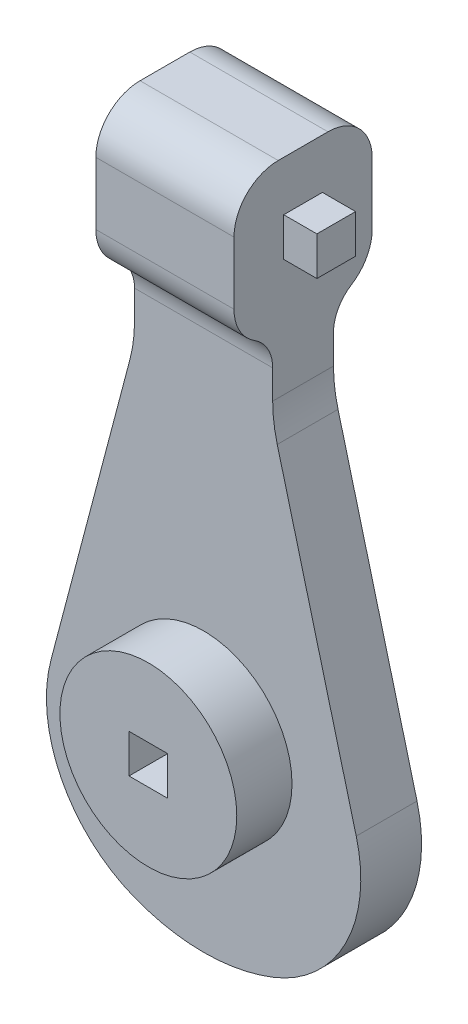
ISO-10303-21;
HEADER;
FILE_DESCRIPTION(('STEP AP214'),'2;1');
FILE_NAME('part.step','',(''),(''),'','','');
FILE_SCHEMA(('AUTOMOTIVE_DESIGN { 1 0 10303 214 1 1 1 1 }'));
ENDSEC;
DATA;
#1=APPLICATION_CONTEXT('core data for automotive mechanical design processes');
#2=APPLICATION_PROTOCOL_DEFINITION('international standard','automotive_design',2000,#1);
#3=PRODUCT_CONTEXT('',#1,'mechanical');
#4=PRODUCT('Part','Part','',(#3));
#5=PRODUCT_RELATED_PRODUCT_CATEGORY('part','',(#4));
#6=PRODUCT_DEFINITION_FORMATION('','',#4);
#7=PRODUCT_DEFINITION_CONTEXT('part definition',#1,'design');
#8=PRODUCT_DEFINITION('design','',#6,#7);
#9=PRODUCT_DEFINITION_SHAPE('','',#8);
#10=(LENGTH_UNIT() NAMED_UNIT(*) SI_UNIT(.MILLI.,.METRE.));
#11=(NAMED_UNIT(*) PLANE_ANGLE_UNIT() SI_UNIT($,.RADIAN.));
#12=(NAMED_UNIT(*) SI_UNIT($,.STERADIAN.) SOLID_ANGLE_UNIT());
#13=UNCERTAINTY_MEASURE_WITH_UNIT(LENGTH_MEASURE(1.E-05),#10,'distance_accuracy_value','');
#14=(GEOMETRIC_REPRESENTATION_CONTEXT(3) GLOBAL_UNCERTAINTY_ASSIGNED_CONTEXT((#13)) GLOBAL_UNIT_ASSIGNED_CONTEXT((#10,
#11,#12)) REPRESENTATION_CONTEXT('',''));
#15=CARTESIAN_POINT('',(0.,0.,0.));
#16=DIRECTION('',(0.,0.,1.));
#17=DIRECTION('',(1.,0.,0.));
#18=AXIS2_PLACEMENT_3D('',#15,#16,#17);
#19=CARTESIAN_POINT('',(-12.5,63.4518338469886,-18.));
#20=DIRECTION('',(-1.,0.,0.));
#21=DIRECTION('',(0.,0.,1.));
#22=AXIS2_PLACEMENT_3D('',#19,#20,#21);
#23=CYLINDRICAL_SURFACE('',#22,7.);
#24=CARTESIAN_POINT('',(-12.5,63.4518338469886,-18.));
#25=DIRECTION('',(1.,0.,0.));
#26=DIRECTION('',(0.,0.,-1.));
#27=AXIS2_PLACEMENT_3D('',#24,#25,#26);
#28=CIRCLE('',#27,7.);
#29=CARTESIAN_POINT('',(-12.5,63.4518338469886,-11.));
#30=VERTEX_POINT('',#29);
#31=CARTESIAN_POINT('',(-12.5,69.3731700325317,-14.2666666666667));
#32=VERTEX_POINT('',#31);
#33=EDGE_CURVE('E449',#30,#32,#28,.F.);
#34=ORIENTED_EDGE('',*,*,#33,.T.);
#35=DIRECTION('',(-1.,0.,0.));
#36=VECTOR('',#35,1.);
#37=CARTESIAN_POINT('',(-12.5,69.3731700325317,-14.2666666666667));
#38=LINE('',#37,#36);
#39=CARTESIAN_POINT('',(12.5,69.3731700325317,-14.2666666666667));
#40=VERTEX_POINT('',#39);
#41=EDGE_CURVE('E474',#32,#40,#38,.F.);
#42=ORIENTED_EDGE('',*,*,#41,.T.);
#43=CARTESIAN_POINT('',(12.5,63.4518338469886,-18.));
#44=DIRECTION('',(1.,0.,0.));
#45=DIRECTION('',(0.,0.,-1.));
#46=AXIS2_PLACEMENT_3D('',#43,#44,#45);
#47=CIRCLE('',#46,7.);
#48=CARTESIAN_POINT('',(12.5,63.4518338469886,-11.));
#49=VERTEX_POINT('',#48);
#50=EDGE_CURVE('E447',#40,#49,#47,.T.);
#51=ORIENTED_EDGE('',*,*,#50,.T.);
#52=DIRECTION('',(-1.,0.,0.));
#53=VECTOR('',#52,1.);
#54=CARTESIAN_POINT('',(0.,63.4518338469886,-11.));
#55=LINE('',#54,#53);
#56=EDGE_CURVE('E444',#30,#49,#55,.F.);
#57=ORIENTED_EDGE('',*,*,#56,.F.);
#58=EDGE_LOOP('',(#34,#42,#51,#57));
#59=FACE_BOUND('',#58,.T.);
#60=ADVANCED_FACE('F38',(#59),#23,.F.);
#61=CARTESIAN_POINT('',(-12.5,63.4518338469886,7.));
#62=DIRECTION('',(-1.,0.,0.));
#63=DIRECTION('',(0.,0.,1.));
#64=AXIS2_PLACEMENT_3D('',#61,#62,#63);
#65=CYLINDRICAL_SURFACE('',#64,7.);
#66=CARTESIAN_POINT('',(12.5,63.4518338469886,7.));
#67=DIRECTION('',(1.,0.,0.));
#68=DIRECTION('',(0.,0.,-1.));
#69=AXIS2_PLACEMENT_3D('',#66,#67,#68);
#70=CIRCLE('',#69,7.);
#71=CARTESIAN_POINT('',(12.5,63.4518338469886,0.));
#72=VERTEX_POINT('',#71);
#73=CARTESIAN_POINT('',(12.5,69.3731700325317,3.26666666666666));
#74=VERTEX_POINT('',#73);
#75=EDGE_CURVE('E441',#72,#74,#70,.T.);
#76=ORIENTED_EDGE('',*,*,#75,.T.);
#77=DIRECTION('',(-1.,0.,0.));
#78=VECTOR('',#77,1.);
#79=CARTESIAN_POINT('',(-12.5,69.3731700325317,3.26666666666667));
#80=LINE('',#79,#78);
#81=CARTESIAN_POINT('',(-12.5,69.3731700325317,3.26666666666666));
#82=VERTEX_POINT('',#81);
#83=EDGE_CURVE('E465',#74,#82,#80,.T.);
#84=ORIENTED_EDGE('',*,*,#83,.T.);
#85=CARTESIAN_POINT('',(-12.5,63.4518338469886,7.));
#86=DIRECTION('',(1.,0.,0.));
#87=DIRECTION('',(0.,0.,-1.));
#88=AXIS2_PLACEMENT_3D('',#85,#86,#87);
#89=CIRCLE('',#88,7.);
#90=CARTESIAN_POINT('',(-12.5,63.4518338469886,0.));
#91=VERTEX_POINT('',#90);
#92=EDGE_CURVE('E439',#82,#91,#89,.F.);
#93=ORIENTED_EDGE('',*,*,#92,.T.);
#94=DIRECTION('',(1.,0.,0.));
#95=VECTOR('',#94,1.);
#96=CARTESIAN_POINT('',(-12.5,63.4518338469886,0.));
#97=LINE('',#96,#95);
#98=EDGE_CURVE('E436',#72,#91,#97,.F.);
#99=ORIENTED_EDGE('',*,*,#98,.F.);
#100=EDGE_LOOP('',(#76,#84,#93,#99));
#101=FACE_BOUND('',#100,.T.);
#102=ADVANCED_FACE('F507',(#101),#65,.F.);
#103=CARTESIAN_POINT('',(12.5,0.,-11.));
#104=DIRECTION('',(1.,0.,0.));
#105=DIRECTION('',(0.,0.,-1.));
#106=AXIS2_PLACEMENT_3D('',#103,#104,#105);
#107=PLANE('',#106);
#108=DIRECTION('',(0.,1.,0.));
#109=VECTOR('',#108,1.);
#110=CARTESIAN_POINT('',(12.5,70.4518338469886,7.));
#111=LINE('',#110,#109);
#112=CARTESIAN_POINT('',(12.5,76.1404113874381,7.));
#113=VERTEX_POINT('',#112);
#114=CARTESIAN_POINT('',(12.5,87.4518338469886,7.));
#115=VERTEX_POINT('',#114);
#116=EDGE_CURVE('E309',#113,#115,#111,.T.);
#117=ORIENTED_EDGE('',*,*,#116,.F.);
#118=CARTESIAN_POINT('',(12.5,76.1404113874381,-1.));
#119=DIRECTION('',(1.,0.,0.));
#120=DIRECTION('',(0.,0.,-1.));
#121=AXIS2_PLACEMENT_3D('',#118,#119,#120);
#122=CIRCLE('',#121,8.);
#123=EDGE_CURVE('E463',#113,#74,#122,.T.);
#124=ORIENTED_EDGE('',*,*,#123,.T.);
#125=ORIENTED_EDGE('',*,*,#75,.F.);
#126=DIRECTION('',(0.,1.,0.));
#127=VECTOR('',#126,1.);
#128=CARTESIAN_POINT('',(12.5,0.,0.));
#129=LINE('',#128,#127);
#130=CARTESIAN_POINT('',(12.5,58.2388212767748,0.));
#131=VERTEX_POINT('',#130);
#132=EDGE_CURVE('E395',#131,#72,#129,.T.);
#133=ORIENTED_EDGE('',*,*,#132,.F.);
#134=DIRECTION('',(0.,0.,1.));
#135=VECTOR('',#134,1.);
#136=CARTESIAN_POINT('',(12.5,58.2388212767748,-11.));
#137=LINE('',#136,#135);
#138=CARTESIAN_POINT('',(12.5,58.2388212767748,-11.));
#139=VERTEX_POINT('',#138);
#140=EDGE_CURVE('E392',#139,#131,#137,.T.);
#141=ORIENTED_EDGE('',*,*,#140,.F.);
#142=DIRECTION('',(0.,1.,0.));
#143=VECTOR('',#142,1.);
#144=CARTESIAN_POINT('',(12.5,0.,-11.));
#145=LINE('',#144,#143);
#146=EDGE_CURVE('E371',#139,#49,#145,.T.);
#147=ORIENTED_EDGE('',*,*,#146,.T.);
#148=ORIENTED_EDGE('',*,*,#50,.F.);
#149=CARTESIAN_POINT('',(12.5,76.1404113874381,-10.));
#150=DIRECTION('',(1.,0.,0.));
#151=DIRECTION('',(0.,0.,-1.));
#152=AXIS2_PLACEMENT_3D('',#149,#150,#151);
#153=CIRCLE('',#152,8.);
#154=CARTESIAN_POINT('',(12.5,76.1404113874381,-18.));
#155=VERTEX_POINT('',#154);
#156=EDGE_CURVE('E461',#40,#155,#153,.T.);
#157=ORIENTED_EDGE('',*,*,#156,.T.);
#158=DIRECTION('',(0.,1.,0.));
#159=VECTOR('',#158,1.);
#160=CARTESIAN_POINT('',(12.5,70.4518338469886,-18.));
#161=LINE('',#160,#159);
#162=CARTESIAN_POINT('',(12.5,87.4518338469886,-18.));
#163=VERTEX_POINT('',#162);
#164=EDGE_CURVE('E315',#155,#163,#161,.T.);
#165=ORIENTED_EDGE('',*,*,#164,.T.);
#166=CARTESIAN_POINT('',(12.5,87.4518338469886,-10.));
#167=DIRECTION('',(1.,0.,0.));
#168=DIRECTION('',(0.,0.,-1.));
#169=AXIS2_PLACEMENT_3D('',#166,#167,#168);
#170=CIRCLE('',#169,8.);
#171=CARTESIAN_POINT('',(12.5,95.4518338469886,-10.));
#172=VERTEX_POINT('',#171);
#173=EDGE_CURVE('E459',#163,#172,#170,.T.);
#174=ORIENTED_EDGE('',*,*,#173,.T.);
#175=DIRECTION('',(0.,0.,1.));
#176=VECTOR('',#175,1.);
#177=CARTESIAN_POINT('',(12.5,95.4518338469886,-18.));
#178=LINE('',#177,#176);
#179=CARTESIAN_POINT('',(12.5,95.4518338469886,-1.));
#180=VERTEX_POINT('',#179);
#181=EDGE_CURVE('E320',#172,#180,#178,.T.);
#182=ORIENTED_EDGE('',*,*,#181,.T.);
#183=CARTESIAN_POINT('',(12.5,87.4518338469886,-1.));
#184=DIRECTION('',(1.,0.,0.));
#185=DIRECTION('',(0.,0.,-1.));
#186=AXIS2_PLACEMENT_3D('',#183,#184,#185);
#187=CIRCLE('',#186,8.);
#188=EDGE_CURVE('E457',#180,#115,#187,.T.);
#189=ORIENTED_EDGE('',*,*,#188,.T.);
#190=EDGE_LOOP('',(#117,#124,#125,#133,#141,#147,#148,#157,#165,#174,#182,#189));
#191=FACE_BOUND('',#190,.T.);
#192=DIRECTION('',(0.,0.,1.));
#193=VECTOR('',#192,1.);
#194=CARTESIAN_POINT('',(12.5,86.4518338469886,-2.));
#195=LINE('',#194,#193);
#196=CARTESIAN_POINT('',(12.5,86.4518338469886,-9.));
#197=VERTEX_POINT('',#196);
#198=CARTESIAN_POINT('',(12.5,86.4518338469886,-2.));
#199=VERTEX_POINT('',#198);
#200=EDGE_CURVE('E294',#197,#199,#195,.T.);
#201=ORIENTED_EDGE('',*,*,#200,.F.);
#202=DIRECTION('',(0.,1.,0.));
#203=VECTOR('',#202,1.);
#204=CARTESIAN_POINT('',(12.5,79.4518338469886,-9.));
#205=LINE('',#204,#203);
#206=CARTESIAN_POINT('',(12.5,79.4518338469886,-9.));
#207=VERTEX_POINT('',#206);
#208=EDGE_CURVE('E248',#207,#197,#205,.T.);
#209=ORIENTED_EDGE('',*,*,#208,.F.);
#210=DIRECTION('',(0.,0.,-1.));
#211=VECTOR('',#210,1.);
#212=CARTESIAN_POINT('',(12.5,79.4518338469886,-2.));
#213=LINE('',#212,#211);
#214=CARTESIAN_POINT('',(12.5,79.4518338469886,-2.));
#215=VERTEX_POINT('',#214);
#216=EDGE_CURVE('E285',#215,#207,#213,.T.);
#217=ORIENTED_EDGE('',*,*,#216,.F.);
#218=DIRECTION('',(0.,-1.,0.));
#219=VECTOR('',#218,1.);
#220=CARTESIAN_POINT('',(12.5,79.4518338469886,-2.));
#221=LINE('',#220,#219);
#222=EDGE_CURVE('E296',#199,#215,#221,.T.);
#223=ORIENTED_EDGE('',*,*,#222,.F.);
#224=EDGE_LOOP('',(#201,#209,#217,#223));
#225=FACE_BOUND('',#224,.T.);
#226=ADVANCED_FACE('F489',(#191,#225),#107,.T.);
#227=CARTESIAN_POINT('',(0.,0.,-11.));
#228=DIRECTION('',(0.,0.,1.));
#229=DIRECTION('',(1.,0.,0.));
#230=AXIS2_PLACEMENT_3D('',#227,#228,#229);
#231=PLANE('',#230);
#232=CARTESIAN_POINT('',(0.,0.,-11.));
#233=DIRECTION('',(0.,0.,1.));
#234=DIRECTION('',(1.,0.,0.));
#235=AXIS2_PLACEMENT_3D('',#232,#233,#234);
#236=CIRCLE('',#235,20.);
#237=CARTESIAN_POINT('',(20.,0.,-11.));
#238=VERTEX_POINT('',#237);
#239=EDGE_CURVE('E365',#238,#238,#236,.T.);
#240=ORIENTED_EDGE('',*,*,#239,.T.);
#241=EDGE_LOOP('',(#240));
#242=FACE_BOUND('',#241,.T.);
#243=DIRECTION('',(0.,1.,0.));
#244=VECTOR('',#243,1.);
#245=CARTESIAN_POINT('',(-12.5,0.,-11.));
#246=LINE('',#245,#244);
#247=CARTESIAN_POINT('',(-12.5,58.2388212767748,-11.));
#248=VERTEX_POINT('',#247);
#249=EDGE_CURVE('E374',#248,#30,#246,.T.);
#250=ORIENTED_EDGE('',*,*,#249,.T.);
#251=ORIENTED_EDGE('',*,*,#56,.T.);
#252=ORIENTED_EDGE('',*,*,#146,.F.);
#253=CARTESIAN_POINT('',(37.5,58.2388212767748,-11.));
#254=DIRECTION('',(0.,0.,1.));
#255=DIRECTION('',(1.,0.,0.));
#256=AXIS2_PLACEMENT_3D('',#253,#254,#255);
#257=CIRCLE('',#256,25.);
#258=CARTESIAN_POINT('',(13.3253445270032,51.8681044598143,-11.));
#259=VERTEX_POINT('',#258);
#260=EDGE_CURVE('E368',#139,#259,#257,.T.);
#261=ORIENTED_EDGE('',*,*,#260,.T.);
#262=DIRECTION('',(-0.254828672678422,0.966986218919874,0.));
#263=VECTOR('',#262,1.);
#264=CARTESIAN_POINT('',(25.2411491513742,6.65176856636852,-11.));
#265=LINE('',#264,#263);
#266=CARTESIAN_POINT('',(27.6175973023709,-2.36602596922271,-11.));
#267=VERTEX_POINT('',#266);
#268=EDGE_CURVE('E389',#267,#259,#265,.T.);
#269=ORIENTED_EDGE('',*,*,#268,.F.);
#270=CARTESIAN_POINT('',(3.44294182937406,-8.73674278618327,-11.));
#271=DIRECTION('',(0.,0.,1.));
#272=DIRECTION('',(1.,0.,0.));
#273=AXIS2_PLACEMENT_3D('',#270,#271,#272);
#274=CIRCLE('',#273,25.);
#275=CARTESIAN_POINT('',(12.6088079354524,-31.995867845511,-11.));
#276=VERTEX_POINT('',#275);
#277=EDGE_CURVE('E387',#267,#276,#274,.F.);
#278=ORIENTED_EDGE('',*,*,#277,.T.);
#279=CARTESIAN_POINT('',(0.,0.,-11.));
#280=DIRECTION('',(0.,0.,1.));
#281=DIRECTION('',(1.,0.,0.));
#282=AXIS2_PLACEMENT_3D('',#279,#280,#281);
#283=CIRCLE('',#282,34.390661475763);
#284=CARTESIAN_POINT('',(-12.6088079354524,-31.995867845511,-11.));
#285=VERTEX_POINT('',#284);
#286=EDGE_CURVE('E385',#276,#285,#283,.F.);
#287=ORIENTED_EDGE('',*,*,#286,.T.);
#288=CARTESIAN_POINT('',(-3.44294182937406,-8.73674278618327,-11.));
#289=DIRECTION('',(0.,0.,1.));
#290=DIRECTION('',(1.,0.,0.));
#291=AXIS2_PLACEMENT_3D('',#288,#289,#290);
#292=CIRCLE('',#291,25.);
#293=CARTESIAN_POINT('',(-27.6175973023709,-2.36602596922271,-11.));
#294=VERTEX_POINT('',#293);
#295=EDGE_CURVE('E382',#294,#285,#292,.T.);
#296=ORIENTED_EDGE('',*,*,#295,.F.);
#297=DIRECTION('',(0.254828672678422,0.966986218919874,0.));
#298=VECTOR('',#297,1.);
#299=CARTESIAN_POINT('',(-25.2411491513742,6.65176856636852,-11.));
#300=LINE('',#299,#298);
#301=CARTESIAN_POINT('',(-13.3253445270032,51.8681044598142,-11.));
#302=VERTEX_POINT('',#301);
#303=EDGE_CURVE('E380',#294,#302,#300,.T.);
#304=ORIENTED_EDGE('',*,*,#303,.T.);
#305=CARTESIAN_POINT('',(-37.5,58.2388212767748,-11.));
#306=DIRECTION('',(0.,0.,1.));
#307=DIRECTION('',(1.,0.,0.));
#308=AXIS2_PLACEMENT_3D('',#305,#306,#307);
#309=CIRCLE('',#308,25.);
#310=EDGE_CURVE('E377',#248,#302,#309,.F.);
#311=ORIENTED_EDGE('',*,*,#310,.F.);
#312=EDGE_LOOP('',(#250,#251,#252,#261,#269,#278,#287,#296,#304,#311));
#313=FACE_BOUND('',#312,.T.);
#314=ADVANCED_FACE('F521',(#242,#313),#231,.F.);
#315=CARTESIAN_POINT('',(0.,0.,0.));
#316=DIRECTION('',(0.,0.,1.));
#317=DIRECTION('',(1.,0.,0.));
#318=AXIS2_PLACEMENT_3D('',#315,#316,#317);
#319=PLANE('',#318);
#320=ORIENTED_EDGE('',*,*,#132,.T.);
#321=ORIENTED_EDGE('',*,*,#98,.T.);
#322=DIRECTION('',(0.,1.,0.));
#323=VECTOR('',#322,1.);
#324=CARTESIAN_POINT('',(-12.5,0.,0.));
#325=LINE('',#324,#323);
#326=CARTESIAN_POINT('',(-12.5,58.2388212767748,0.));
#327=VERTEX_POINT('',#326);
#328=EDGE_CURVE('E398',#327,#91,#325,.T.);
#329=ORIENTED_EDGE('',*,*,#328,.F.);
#330=CARTESIAN_POINT('',(-37.5,58.2388212767748,0.));
#331=DIRECTION('',(0.,0.,1.));
#332=DIRECTION('',(1.,0.,0.));
#333=AXIS2_PLACEMENT_3D('',#330,#331,#332);
#334=CIRCLE('',#333,25.);
#335=CARTESIAN_POINT('',(-13.3253445270032,51.8681044598142,0.));
#336=VERTEX_POINT('',#335);
#337=EDGE_CURVE('E401',#327,#336,#334,.F.);
#338=ORIENTED_EDGE('',*,*,#337,.T.);
#339=DIRECTION('',(0.254828672678422,0.966986218919874,0.));
#340=VECTOR('',#339,1.);
#341=CARTESIAN_POINT('',(-25.2411491513742,6.65176856636852,0.));
#342=LINE('',#341,#340);
#343=CARTESIAN_POINT('',(-27.6175973023709,-2.36602596922271,0.));
#344=VERTEX_POINT('',#343);
#345=EDGE_CURVE('E404',#344,#336,#342,.T.);
#346=ORIENTED_EDGE('',*,*,#345,.F.);
#347=CARTESIAN_POINT('',(-3.44294182937406,-8.73674278618327,0.));
#348=DIRECTION('',(0.,0.,1.));
#349=DIRECTION('',(1.,0.,0.));
#350=AXIS2_PLACEMENT_3D('',#347,#348,#349);
#351=CIRCLE('',#350,25.);
#352=CARTESIAN_POINT('',(-12.6088079354524,-31.995867845511,0.));
#353=VERTEX_POINT('',#352);
#354=EDGE_CURVE('E407',#344,#353,#351,.T.);
#355=ORIENTED_EDGE('',*,*,#354,.T.);
#356=CARTESIAN_POINT('',(0.,0.,0.));
#357=DIRECTION('',(0.,0.,1.));
#358=DIRECTION('',(1.,0.,0.));
#359=AXIS2_PLACEMENT_3D('',#356,#357,#358);
#360=CIRCLE('',#359,34.390661475763);
#361=CARTESIAN_POINT('',(12.6088079354524,-31.995867845511,0.));
#362=VERTEX_POINT('',#361);
#363=EDGE_CURVE('E410',#362,#353,#360,.F.);
#364=ORIENTED_EDGE('',*,*,#363,.F.);
#365=CARTESIAN_POINT('',(3.44294182937406,-8.73674278618327,0.));
#366=DIRECTION('',(0.,0.,1.));
#367=DIRECTION('',(1.,0.,0.));
#368=AXIS2_PLACEMENT_3D('',#365,#366,#367);
#369=CIRCLE('',#368,25.);
#370=CARTESIAN_POINT('',(27.6175973023709,-2.36602596922271,0.));
#371=VERTEX_POINT('',#370);
#372=EDGE_CURVE('E413',#371,#362,#369,.F.);
#373=ORIENTED_EDGE('',*,*,#372,.F.);
#374=DIRECTION('',(-0.254828672678422,0.966986218919874,0.));
#375=VECTOR('',#374,1.);
#376=CARTESIAN_POINT('',(25.2411491513742,6.65176856636852,0.));
#377=LINE('',#376,#375);
#378=CARTESIAN_POINT('',(13.3253445270032,51.8681044598143,0.));
#379=VERTEX_POINT('',#378);
#380=EDGE_CURVE('E369',#371,#379,#377,.T.);
#381=ORIENTED_EDGE('',*,*,#380,.T.);
#382=CARTESIAN_POINT('',(37.5,58.2388212767748,0.));
#383=DIRECTION('',(0.,0.,1.));
#384=DIRECTION('',(1.,0.,0.));
#385=AXIS2_PLACEMENT_3D('',#382,#383,#384);
#386=CIRCLE('',#385,25.);
#387=EDGE_CURVE('E362',#131,#379,#386,.T.);
#388=ORIENTED_EDGE('',*,*,#387,.F.);
#389=EDGE_LOOP('',(#320,#321,#329,#338,#346,#355,#364,#373,#381,#388));
#390=FACE_BOUND('',#389,.T.);
#391=CARTESIAN_POINT('',(0.,0.,0.));
#392=DIRECTION('',(0.,0.,1.));
#393=DIRECTION('',(1.,0.,0.));
#394=AXIS2_PLACEMENT_3D('',#391,#392,#393);
#395=CIRCLE('',#394,16.);
#396=CARTESIAN_POINT('',(16.,0.,0.));
#397=VERTEX_POINT('',#396);
#398=EDGE_CURVE('E352',#397,#397,#395,.T.);
#399=ORIENTED_EDGE('',*,*,#398,.F.);
#400=EDGE_LOOP('',(#399));
#401=FACE_BOUND('',#400,.T.);
#402=ADVANCED_FACE('F511',(#390,#401),#319,.T.);
#403=CARTESIAN_POINT('',(0.,0.,-11.));
#404=DIRECTION('',(0.,0.,1.));
#405=DIRECTION('',(1.,0.,0.));
#406=AXIS2_PLACEMENT_3D('',#403,#404,#405);
#407=CYLINDRICAL_SURFACE('',#406,20.);
#408=ORIENTED_EDGE('',*,*,#239,.F.);
#409=EDGE_LOOP('',(#408));
#410=FACE_BOUND('',#409,.T.);
#411=CARTESIAN_POINT('',(0.,0.,-6.));
#412=DIRECTION('',(0.,0.,1.));
#413=DIRECTION('',(1.,0.,0.));
#414=AXIS2_PLACEMENT_3D('',#411,#412,#413);
#415=CIRCLE('',#414,20.);
#416=CARTESIAN_POINT('',(20.,0.,-6.));
#417=VERTEX_POINT('',#416);
#418=EDGE_CURVE('E419',#417,#417,#415,.F.);
#419=ORIENTED_EDGE('',*,*,#418,.F.);
#420=EDGE_LOOP('',(#419));
#421=FACE_BOUND('',#420,.T.);
#422=ADVANCED_FACE('F547',(#410,#421),#407,.F.);
#423=CARTESIAN_POINT('',(37.5,58.2388212767748,-11.));
#424=DIRECTION('',(0.,0.,1.));
#425=DIRECTION('',(1.,0.,0.));
#426=AXIS2_PLACEMENT_3D('',#423,#424,#425);
#427=CYLINDRICAL_SURFACE('',#426,25.);
#428=ORIENTED_EDGE('',*,*,#387,.T.);
#429=DIRECTION('',(0.,0.,1.));
#430=VECTOR('',#429,1.);
#431=CARTESIAN_POINT('',(13.3253445270032,51.8681044598143,-11.));
#432=LINE('',#431,#430);
#433=EDGE_CURVE('E417',#259,#379,#432,.T.);
#434=ORIENTED_EDGE('',*,*,#433,.F.);
#435=ORIENTED_EDGE('',*,*,#260,.F.);
#436=ORIENTED_EDGE('',*,*,#140,.T.);
#437=EDGE_LOOP('',(#428,#434,#435,#436));
#438=FACE_BOUND('',#437,.T.);
#439=ADVANCED_FACE('F518',(#438),#427,.F.);
#440=CARTESIAN_POINT('',(25.2411491513742,6.65176856636852,-11.));
#441=DIRECTION('',(0.966986218919874,0.254828672678422,0.));
#442=DIRECTION('',(-0.254828672678422,0.966986218919874,0.));
#443=AXIS2_PLACEMENT_3D('',#440,#441,#442);
#444=PLANE('',#443);
#445=ORIENTED_EDGE('',*,*,#380,.F.);
#446=DIRECTION('',(0.,0.,1.));
#447=VECTOR('',#446,1.);
#448=CARTESIAN_POINT('',(27.6175973023709,-2.36602596922271,-11.));
#449=LINE('',#448,#447);
#450=EDGE_CURVE('E420',#267,#371,#449,.T.);
#451=ORIENTED_EDGE('',*,*,#450,.F.);
#452=ORIENTED_EDGE('',*,*,#268,.T.);
#453=ORIENTED_EDGE('',*,*,#433,.T.);
#454=EDGE_LOOP('',(#445,#451,#452,#453));
#455=FACE_BOUND('',#454,.T.);
#456=ADVANCED_FACE('F553',(#455),#444,.T.);
#457=CARTESIAN_POINT('',(3.44294182937406,-8.73674278618327,-11.));
#458=DIRECTION('',(0.,0.,1.));
#459=DIRECTION('',(1.,0.,0.));
#460=AXIS2_PLACEMENT_3D('',#457,#458,#459);
#461=CYLINDRICAL_SURFACE('',#460,25.);
#462=ORIENTED_EDGE('',*,*,#372,.T.);
#463=DIRECTION('',(0.,0.,1.));
#464=VECTOR('',#463,1.);
#465=CARTESIAN_POINT('',(12.6088079354524,-31.995867845511,-11.));
#466=LINE('',#465,#464);
#467=EDGE_CURVE('E422',#276,#362,#466,.T.);
#468=ORIENTED_EDGE('',*,*,#467,.F.);
#469=ORIENTED_EDGE('',*,*,#277,.F.);
#470=ORIENTED_EDGE('',*,*,#450,.T.);
#471=EDGE_LOOP('',(#462,#468,#469,#470));
#472=FACE_BOUND('',#471,.T.);
#473=ADVANCED_FACE('F574',(#472),#461,.T.);
#474=CARTESIAN_POINT('',(0.,0.,-11.));
#475=DIRECTION('',(0.,0.,1.));
#476=DIRECTION('',(1.,0.,0.));
#477=AXIS2_PLACEMENT_3D('',#474,#475,#476);
#478=CYLINDRICAL_SURFACE('',#477,34.390661475763);
#479=ORIENTED_EDGE('',*,*,#363,.T.);
#480=DIRECTION('',(0.,0.,1.));
#481=VECTOR('',#480,1.);
#482=CARTESIAN_POINT('',(-12.6088079354524,-31.995867845511,-11.));
#483=LINE('',#482,#481);
#484=EDGE_CURVE('E425',#285,#353,#483,.T.);
#485=ORIENTED_EDGE('',*,*,#484,.F.);
#486=ORIENTED_EDGE('',*,*,#286,.F.);
#487=ORIENTED_EDGE('',*,*,#467,.T.);
#488=EDGE_LOOP('',(#479,#485,#486,#487));
#489=FACE_BOUND('',#488,.T.);
#490=ADVANCED_FACE('F570',(#489),#478,.T.);
#491=CARTESIAN_POINT('',(-3.44294182937406,-8.73674278618327,-11.));
#492=DIRECTION('',(0.,0.,1.));
#493=DIRECTION('',(1.,0.,0.));
#494=AXIS2_PLACEMENT_3D('',#491,#492,#493);
#495=CYLINDRICAL_SURFACE('',#494,25.);
#496=ORIENTED_EDGE('',*,*,#354,.F.);
#497=DIRECTION('',(0.,0.,1.));
#498=VECTOR('',#497,1.);
#499=CARTESIAN_POINT('',(-27.6175973023709,-2.36602596922271,-11.));
#500=LINE('',#499,#498);
#501=EDGE_CURVE('E427',#294,#344,#500,.T.);
#502=ORIENTED_EDGE('',*,*,#501,.F.);
#503=ORIENTED_EDGE('',*,*,#295,.T.);
#504=ORIENTED_EDGE('',*,*,#484,.T.);
#505=EDGE_LOOP('',(#496,#502,#503,#504));
#506=FACE_BOUND('',#505,.T.);
#507=ADVANCED_FACE('F566',(#506),#495,.T.);
#508=CARTESIAN_POINT('',(-25.2411491513742,6.65176856636852,-11.));
#509=DIRECTION('',(0.966986218919874,-0.254828672678422,0.));
#510=DIRECTION('',(0.254828672678422,0.966986218919874,0.));
#511=AXIS2_PLACEMENT_3D('',#508,#509,#510);
#512=PLANE('',#511);
#513=ORIENTED_EDGE('',*,*,#345,.T.);
#514=DIRECTION('',(0.,0.,1.));
#515=VECTOR('',#514,1.);
#516=CARTESIAN_POINT('',(-13.3253445270032,51.8681044598142,-11.));
#517=LINE('',#516,#515);
#518=EDGE_CURVE('E429',#302,#336,#517,.T.);
#519=ORIENTED_EDGE('',*,*,#518,.F.);
#520=ORIENTED_EDGE('',*,*,#303,.F.);
#521=ORIENTED_EDGE('',*,*,#501,.T.);
#522=EDGE_LOOP('',(#513,#519,#520,#521));
#523=FACE_BOUND('',#522,.T.);
#524=ADVANCED_FACE('F562',(#523),#512,.F.);
#525=CARTESIAN_POINT('',(-37.5,58.2388212767748,-11.));
#526=DIRECTION('',(0.,0.,1.));
#527=DIRECTION('',(1.,0.,0.));
#528=AXIS2_PLACEMENT_3D('',#525,#526,#527);
#529=CYLINDRICAL_SURFACE('',#528,25.);
#530=ORIENTED_EDGE('',*,*,#337,.F.);
#531=DIRECTION('',(0.,0.,1.));
#532=VECTOR('',#531,1.);
#533=CARTESIAN_POINT('',(-12.5,58.2388212767748,-11.));
#534=LINE('',#533,#532);
#535=EDGE_CURVE('E431',#248,#327,#534,.T.);
#536=ORIENTED_EDGE('',*,*,#535,.F.);
#537=ORIENTED_EDGE('',*,*,#310,.T.);
#538=ORIENTED_EDGE('',*,*,#518,.T.);
#539=EDGE_LOOP('',(#530,#536,#537,#538));
#540=FACE_BOUND('',#539,.T.);
#541=ADVANCED_FACE('F559',(#540),#529,.F.);
#542=CARTESIAN_POINT('',(-12.5,0.,-11.));
#543=DIRECTION('',(1.,0.,0.));
#544=DIRECTION('',(0.,0.,-1.));
#545=AXIS2_PLACEMENT_3D('',#542,#543,#544);
#546=PLANE('',#545);
#547=ORIENTED_EDGE('',*,*,#92,.F.);
#548=CARTESIAN_POINT('',(-12.5,76.1404113874381,-1.));
#549=DIRECTION('',(1.,0.,0.));
#550=DIRECTION('',(0.,0.,-1.));
#551=AXIS2_PLACEMENT_3D('',#548,#549,#550);
#552=CIRCLE('',#551,8.);
#553=CARTESIAN_POINT('',(-12.5,76.1404113874381,7.));
#554=VERTEX_POINT('',#553);
#555=EDGE_CURVE('E472',#82,#554,#552,.F.);
#556=ORIENTED_EDGE('',*,*,#555,.T.);
#557=DIRECTION('',(0.,-1.,0.));
#558=VECTOR('',#557,1.);
#559=CARTESIAN_POINT('',(-12.5,70.4518338469886,7.));
#560=LINE('',#559,#558);
#561=CARTESIAN_POINT('',(-12.5,87.4518338469886,7.));
#562=VERTEX_POINT('',#561);
#563=EDGE_CURVE('E312',#562,#554,#560,.T.);
#564=ORIENTED_EDGE('',*,*,#563,.F.);
#565=CARTESIAN_POINT('',(-12.5,87.4518338469886,-1.));
#566=DIRECTION('',(1.,0.,0.));
#567=DIRECTION('',(0.,0.,-1.));
#568=AXIS2_PLACEMENT_3D('',#565,#566,#567);
#569=CIRCLE('',#568,8.);
#570=CARTESIAN_POINT('',(-12.5,95.4518338469886,-1.));
#571=VERTEX_POINT('',#570);
#572=EDGE_CURVE('E467',#562,#571,#569,.F.);
#573=ORIENTED_EDGE('',*,*,#572,.T.);
#574=DIRECTION('',(0.,0.,1.));
#575=VECTOR('',#574,1.);
#576=CARTESIAN_POINT('',(-12.5,95.4518338469886,-18.));
#577=LINE('',#576,#575);
#578=CARTESIAN_POINT('',(-12.5,95.4518338469886,-10.));
#579=VERTEX_POINT('',#578);
#580=EDGE_CURVE('E321',#579,#571,#577,.T.);
#581=ORIENTED_EDGE('',*,*,#580,.F.);
#582=CARTESIAN_POINT('',(-12.5,87.4518338469886,-10.));
#583=DIRECTION('',(1.,0.,0.));
#584=DIRECTION('',(0.,0.,-1.));
#585=AXIS2_PLACEMENT_3D('',#582,#583,#584);
#586=CIRCLE('',#585,8.);
#587=CARTESIAN_POINT('',(-12.5,87.4518338469886,-18.));
#588=VERTEX_POINT('',#587);
#589=EDGE_CURVE('E469',#579,#588,#586,.F.);
#590=ORIENTED_EDGE('',*,*,#589,.T.);
#591=DIRECTION('',(0.,-1.,0.));
#592=VECTOR('',#591,1.);
#593=CARTESIAN_POINT('',(-12.5,70.4518338469886,-18.));
#594=LINE('',#593,#592);
#595=CARTESIAN_POINT('',(-12.5,76.1404113874381,-18.));
#596=VERTEX_POINT('',#595);
#597=EDGE_CURVE('E318',#588,#596,#594,.T.);
#598=ORIENTED_EDGE('',*,*,#597,.T.);
#599=CARTESIAN_POINT('',(-12.5,76.1404113874381,-10.));
#600=DIRECTION('',(1.,0.,0.));
#601=DIRECTION('',(0.,0.,-1.));
#602=AXIS2_PLACEMENT_3D('',#599,#600,#601);
#603=CIRCLE('',#602,8.);
#604=EDGE_CURVE('E53',#596,#32,#603,.F.);
#605=ORIENTED_EDGE('',*,*,#604,.T.);
#606=ORIENTED_EDGE('',*,*,#33,.F.);
#607=ORIENTED_EDGE('',*,*,#249,.F.);
#608=ORIENTED_EDGE('',*,*,#535,.T.);
#609=ORIENTED_EDGE('',*,*,#328,.T.);
#610=EDGE_LOOP('',(#547,#556,#564,#573,#581,#590,#598,#605,#606,#607,#608,#609));
#611=FACE_BOUND('',#610,.T.);
#612=DIRECTION('',(0.,0.,-1.));
#613=VECTOR('',#612,1.);
#614=CARTESIAN_POINT('',(-12.5,79.4518338469886,-2.));
#615=LINE('',#614,#613);
#616=CARTESIAN_POINT('',(-12.5,79.4518338469886,-2.));
#617=VERTEX_POINT('',#616);
#618=CARTESIAN_POINT('',(-12.5,79.4518338469886,-9.));
#619=VERTEX_POINT('',#618);
#620=EDGE_CURVE('E269',#617,#619,#615,.T.);
#621=ORIENTED_EDGE('',*,*,#620,.T.);
#622=DIRECTION('',(0.,1.,0.));
#623=VECTOR('',#622,1.);
#624=CARTESIAN_POINT('',(-12.5,79.4518338469886,-9.));
#625=LINE('',#624,#623);
#626=CARTESIAN_POINT('',(-12.5,86.4518338469886,-9.));
#627=VERTEX_POINT('',#626);
#628=EDGE_CURVE('E243',#619,#627,#625,.T.);
#629=ORIENTED_EDGE('',*,*,#628,.T.);
#630=DIRECTION('',(0.,0.,1.));
#631=VECTOR('',#630,1.);
#632=CARTESIAN_POINT('',(-12.5,86.4518338469886,-2.));
#633=LINE('',#632,#631);
#634=CARTESIAN_POINT('',(-12.5,86.4518338469886,-2.));
#635=VERTEX_POINT('',#634);
#636=EDGE_CURVE('E259',#627,#635,#633,.T.);
#637=ORIENTED_EDGE('',*,*,#636,.T.);
#638=DIRECTION('',(0.,-1.,0.));
#639=VECTOR('',#638,1.);
#640=CARTESIAN_POINT('',(-12.5,79.4518338469886,-2.));
#641=LINE('',#640,#639);
#642=EDGE_CURVE('E271',#635,#617,#641,.T.);
#643=ORIENTED_EDGE('',*,*,#642,.T.);
#644=EDGE_LOOP('',(#621,#629,#637,#643));
#645=FACE_BOUND('',#644,.T.);
#646=ADVANCED_FACE('F498',(#611,#645),#546,.F.);
#647=CARTESIAN_POINT('',(0.,0.,-6.));
#648=DIRECTION('',(0.,0.,1.));
#649=DIRECTION('',(1.,0.,0.));
#650=AXIS2_PLACEMENT_3D('',#647,#648,#649);
#651=PLANE('',#650);
#652=ORIENTED_EDGE('',*,*,#418,.T.);
#653=EDGE_LOOP('',(#652));
#654=FACE_BOUND('',#653,.T.);
#655=ADVANCED_FACE('F558',(#654),#651,.F.);
#656=CARTESIAN_POINT('',(0.,0.,10.));
#657=DIRECTION('',(0.,0.,-1.));
#658=DIRECTION('',(-1.,0.,0.));
#659=AXIS2_PLACEMENT_3D('',#656,#657,#658);
#660=CYLINDRICAL_SURFACE('',#659,16.);
#661=CARTESIAN_POINT('',(0.,0.,10.));
#662=DIRECTION('',(0.,0.,1.));
#663=DIRECTION('',(1.,0.,0.));
#664=AXIS2_PLACEMENT_3D('',#661,#662,#663);
#665=CIRCLE('',#664,16.);
#666=CARTESIAN_POINT('',(16.,0.,10.));
#667=VERTEX_POINT('',#666);
#668=EDGE_CURVE('E359',#667,#667,#665,.T.);
#669=ORIENTED_EDGE('',*,*,#668,.F.);
#670=EDGE_LOOP('',(#669));
#671=FACE_BOUND('',#670,.T.);
#672=ORIENTED_EDGE('',*,*,#398,.T.);
#673=EDGE_LOOP('',(#672));
#674=FACE_BOUND('',#673,.T.);
#675=ADVANCED_FACE('F589',(#671,#674),#660,.T.);
#676=CARTESIAN_POINT('',(0.,0.,10.));
#677=DIRECTION('',(0.,0.,1.));
#678=DIRECTION('',(1.,0.,0.));
#679=AXIS2_PLACEMENT_3D('',#676,#677,#678);
#680=PLANE('',#679);
#681=DIRECTION('',(1.,0.,0.));
#682=VECTOR('',#681,1.);
#683=CARTESIAN_POINT('',(-3.5,-3.5,10.));
#684=LINE('',#683,#682);
#685=CARTESIAN_POINT('',(-3.5,-3.5,10.));
#686=VERTEX_POINT('',#685);
#687=CARTESIAN_POINT('',(3.5,-3.5,10.));
#688=VERTEX_POINT('',#687);
#689=EDGE_CURVE('E324',#686,#688,#684,.T.);
#690=ORIENTED_EDGE('',*,*,#689,.F.);
#691=DIRECTION('',(0.,-1.,0.));
#692=VECTOR('',#691,1.);
#693=CARTESIAN_POINT('',(-3.5,-3.5,10.));
#694=LINE('',#693,#692);
#695=CARTESIAN_POINT('',(-3.5,3.5,10.));
#696=VERTEX_POINT('',#695);
#697=EDGE_CURVE('E331',#696,#686,#694,.T.);
#698=ORIENTED_EDGE('',*,*,#697,.F.);
#699=DIRECTION('',(-1.,0.,0.));
#700=VECTOR('',#699,1.);
#701=CARTESIAN_POINT('',(-3.5,3.5,10.));
#702=LINE('',#701,#700);
#703=CARTESIAN_POINT('',(3.5,3.5,10.));
#704=VERTEX_POINT('',#703);
#705=EDGE_CURVE('E345',#704,#696,#702,.T.);
#706=ORIENTED_EDGE('',*,*,#705,.F.);
#707=DIRECTION('',(0.,1.,0.));
#708=VECTOR('',#707,1.);
#709=CARTESIAN_POINT('',(3.5,-3.5,10.));
#710=LINE('',#709,#708);
#711=EDGE_CURVE('E342',#688,#704,#710,.T.);
#712=ORIENTED_EDGE('',*,*,#711,.F.);
#713=EDGE_LOOP('',(#690,#698,#706,#712));
#714=FACE_BOUND('',#713,.T.);
#715=ORIENTED_EDGE('',*,*,#668,.T.);
#716=EDGE_LOOP('',(#715));
#717=FACE_BOUND('',#716,.T.);
#718=ADVANCED_FACE('F593',(#714,#717),#680,.T.);
#719=CARTESIAN_POINT('',(-3.5,-3.5,3.));
#720=DIRECTION('',(0.,-1.,0.));
#721=DIRECTION('',(1.,0.,0.));
#722=AXIS2_PLACEMENT_3D('',#719,#720,#721);
#723=PLANE('',#722);
#724=ORIENTED_EDGE('',*,*,#689,.T.);
#725=DIRECTION('',(0.,0.,1.));
#726=VECTOR('',#725,1.);
#727=CARTESIAN_POINT('',(3.5,-3.5,3.));
#728=LINE('',#727,#726);
#729=CARTESIAN_POINT('',(3.5,-3.5,3.));
#730=VERTEX_POINT('',#729);
#731=EDGE_CURVE('E340',#730,#688,#728,.T.);
#732=ORIENTED_EDGE('',*,*,#731,.F.);
#733=DIRECTION('',(1.,0.,0.));
#734=VECTOR('',#733,1.);
#735=CARTESIAN_POINT('',(-3.5,-3.5,3.));
#736=LINE('',#735,#734);
#737=CARTESIAN_POINT('',(-3.5,-3.5,3.));
#738=VERTEX_POINT('',#737);
#739=EDGE_CURVE('E327',#738,#730,#736,.T.);
#740=ORIENTED_EDGE('',*,*,#739,.F.);
#741=DIRECTION('',(0.,0.,1.));
#742=VECTOR('',#741,1.);
#743=CARTESIAN_POINT('',(-3.5,-3.5,3.));
#744=LINE('',#743,#742);
#745=EDGE_CURVE('E350',#738,#686,#744,.T.);
#746=ORIENTED_EDGE('',*,*,#745,.T.);
#747=EDGE_LOOP('',(#724,#732,#740,#746));
#748=FACE_BOUND('',#747,.T.);
#749=ADVANCED_FACE('F597',(#748),#723,.F.);
#750=CARTESIAN_POINT('',(-3.5,-3.5,3.));
#751=DIRECTION('',(-1.,0.,0.));
#752=DIRECTION('',(0.,0.,1.));
#753=AXIS2_PLACEMENT_3D('',#750,#751,#752);
#754=PLANE('',#753);
#755=ORIENTED_EDGE('',*,*,#697,.T.);
#756=ORIENTED_EDGE('',*,*,#745,.F.);
#757=DIRECTION('',(0.,-1.,0.));
#758=VECTOR('',#757,1.);
#759=CARTESIAN_POINT('',(-3.5,-3.5,3.));
#760=LINE('',#759,#758);
#761=CARTESIAN_POINT('',(-3.5,3.5,3.));
#762=VERTEX_POINT('',#761);
#763=EDGE_CURVE('E337',#762,#738,#760,.T.);
#764=ORIENTED_EDGE('',*,*,#763,.F.);
#765=DIRECTION('',(0.,0.,1.));
#766=VECTOR('',#765,1.);
#767=CARTESIAN_POINT('',(-3.5,3.5,3.));
#768=LINE('',#767,#766);
#769=EDGE_CURVE('E353',#762,#696,#768,.T.);
#770=ORIENTED_EDGE('',*,*,#769,.T.);
#771=EDGE_LOOP('',(#755,#756,#764,#770));
#772=FACE_BOUND('',#771,.T.);
#773=ADVANCED_FACE('F601',(#772),#754,.F.);
#774=CARTESIAN_POINT('',(-3.5,3.5,3.));
#775=DIRECTION('',(0.,1.,0.));
#776=DIRECTION('',(0.,0.,1.));
#777=AXIS2_PLACEMENT_3D('',#774,#775,#776);
#778=PLANE('',#777);
#779=ORIENTED_EDGE('',*,*,#705,.T.);
#780=ORIENTED_EDGE('',*,*,#769,.F.);
#781=DIRECTION('',(-1.,0.,0.));
#782=VECTOR('',#781,1.);
#783=CARTESIAN_POINT('',(-3.5,3.5,3.));
#784=LINE('',#783,#782);
#785=CARTESIAN_POINT('',(3.5,3.5,3.));
#786=VERTEX_POINT('',#785);
#787=EDGE_CURVE('E334',#786,#762,#784,.T.);
#788=ORIENTED_EDGE('',*,*,#787,.F.);
#789=DIRECTION('',(0.,0.,1.));
#790=VECTOR('',#789,1.);
#791=CARTESIAN_POINT('',(3.5,3.5,3.));
#792=LINE('',#791,#790);
#793=EDGE_CURVE('E355',#786,#704,#792,.T.);
#794=ORIENTED_EDGE('',*,*,#793,.T.);
#795=EDGE_LOOP('',(#779,#780,#788,#794));
#796=FACE_BOUND('',#795,.T.);
#797=ADVANCED_FACE('F607',(#796),#778,.F.);
#798=CARTESIAN_POINT('',(3.5,-3.5,3.));
#799=DIRECTION('',(1.,0.,0.));
#800=DIRECTION('',(0.,1.,0.));
#801=AXIS2_PLACEMENT_3D('',#798,#799,#800);
#802=PLANE('',#801);
#803=ORIENTED_EDGE('',*,*,#711,.T.);
#804=ORIENTED_EDGE('',*,*,#793,.F.);
#805=DIRECTION('',(0.,1.,0.));
#806=VECTOR('',#805,1.);
#807=CARTESIAN_POINT('',(3.5,-3.5,3.));
#808=LINE('',#807,#806);
#809=EDGE_CURVE('E330',#730,#786,#808,.T.);
#810=ORIENTED_EDGE('',*,*,#809,.F.);
#811=ORIENTED_EDGE('',*,*,#731,.T.);
#812=EDGE_LOOP('',(#803,#804,#810,#811));
#813=FACE_BOUND('',#812,.T.);
#814=ADVANCED_FACE('F603',(#813),#802,.F.);
#815=CARTESIAN_POINT('',(0.,0.,3.));
#816=DIRECTION('',(0.,0.,1.));
#817=DIRECTION('',(1.,0.,0.));
#818=AXIS2_PLACEMENT_3D('',#815,#816,#817);
#819=PLANE('',#818);
#820=ORIENTED_EDGE('',*,*,#739,.T.);
#821=ORIENTED_EDGE('',*,*,#809,.T.);
#822=ORIENTED_EDGE('',*,*,#787,.T.);
#823=ORIENTED_EDGE('',*,*,#763,.T.);
#824=EDGE_LOOP('',(#820,#821,#822,#823));
#825=FACE_BOUND('',#824,.T.);
#826=ADVANCED_FACE('F606',(#825),#819,.T.);
#827=CARTESIAN_POINT('',(0.,0.,7.));
#828=DIRECTION('',(0.,0.,-1.));
#829=DIRECTION('',(-1.,0.,0.));
#830=AXIS2_PLACEMENT_3D('',#827,#828,#829);
#831=PLANE('',#830);
#832=ORIENTED_EDGE('',*,*,#563,.T.);
#833=DIRECTION('',(-1.,0.,0.));
#834=VECTOR('',#833,1.);
#835=CARTESIAN_POINT('',(0.,76.1404113874381,7.));
#836=LINE('',#835,#834);
#837=EDGE_CURVE('E454',#554,#113,#836,.F.);
#838=ORIENTED_EDGE('',*,*,#837,.T.);
#839=ORIENTED_EDGE('',*,*,#116,.T.);
#840=DIRECTION('',(-1.,0.,0.));
#841=VECTOR('',#840,1.);
#842=CARTESIAN_POINT('',(-12.5,87.4518338469886,7.));
#843=LINE('',#842,#841);
#844=EDGE_CURVE('E451',#115,#562,#843,.T.);
#845=ORIENTED_EDGE('',*,*,#844,.T.);
#846=EDGE_LOOP('',(#832,#838,#839,#845));
#847=FACE_BOUND('',#846,.T.);
#848=ADVANCED_FACE('F495',(#847),#831,.F.);
#849=CARTESIAN_POINT('',(-12.5,95.4518338469886,-18.));
#850=DIRECTION('',(0.,1.,0.));
#851=DIRECTION('',(0.,0.,1.));
#852=AXIS2_PLACEMENT_3D('',#849,#850,#851);
#853=PLANE('',#852);
#854=ORIENTED_EDGE('',*,*,#181,.F.);
#855=DIRECTION('',(-1.,0.,0.));
#856=VECTOR('',#855,1.);
#857=CARTESIAN_POINT('',(-12.5,95.4518338469886,-10.));
#858=LINE('',#857,#856);
#859=EDGE_CURVE('E11',#172,#579,#858,.T.);
#860=ORIENTED_EDGE('',*,*,#859,.T.);
#861=ORIENTED_EDGE('',*,*,#580,.T.);
#862=DIRECTION('',(-1.,0.,0.));
#863=VECTOR('',#862,1.);
#864=CARTESIAN_POINT('',(12.5,95.4518338469886,-1.));
#865=LINE('',#864,#863);
#866=EDGE_CURVE('E46',#571,#180,#865,.F.);
#867=ORIENTED_EDGE('',*,*,#866,.T.);
#868=EDGE_LOOP('',(#854,#860,#861,#867));
#869=FACE_BOUND('',#868,.T.);
#870=ADVANCED_FACE('F482',(#869),#853,.T.);
#871=CARTESIAN_POINT('',(0.,0.,-18.));
#872=DIRECTION('',(0.,0.,-1.));
#873=DIRECTION('',(-1.,0.,0.));
#874=AXIS2_PLACEMENT_3D('',#871,#872,#873);
#875=PLANE('',#874);
#876=ORIENTED_EDGE('',*,*,#164,.F.);
#877=DIRECTION('',(1.,0.,0.));
#878=VECTOR('',#877,1.);
#879=CARTESIAN_POINT('',(-12.5,76.1404113874381,-18.));
#880=LINE('',#879,#878);
#881=EDGE_CURVE('E61',#155,#596,#880,.F.);
#882=ORIENTED_EDGE('',*,*,#881,.T.);
#883=ORIENTED_EDGE('',*,*,#597,.F.);
#884=DIRECTION('',(-1.,0.,0.));
#885=VECTOR('',#884,1.);
#886=CARTESIAN_POINT('',(0.,87.4518338469886,-18.));
#887=LINE('',#886,#885);
#888=EDGE_CURVE('E477',#588,#163,#887,.F.);
#889=ORIENTED_EDGE('',*,*,#888,.T.);
#890=EDGE_LOOP('',(#876,#882,#883,#889));
#891=FACE_BOUND('',#890,.T.);
#892=ADVANCED_FACE('F528',(#891),#875,.T.);
#893=CARTESIAN_POINT('',(18.5,79.4518338469886,-9.));
#894=DIRECTION('',(0.,0.,1.));
#895=DIRECTION('',(1.,0.,0.));
#896=AXIS2_PLACEMENT_3D('',#893,#894,#895);
#897=PLANE('',#896);
#898=ORIENTED_EDGE('',*,*,#208,.T.);
#899=DIRECTION('',(-1.,0.,0.));
#900=VECTOR('',#899,1.);
#901=CARTESIAN_POINT('',(18.5,86.4518338469886,-9.));
#902=LINE('',#901,#900);
#903=CARTESIAN_POINT('',(18.5,86.4518338469886,-9.));
#904=VERTEX_POINT('',#903);
#905=EDGE_CURVE('E307',#904,#197,#902,.T.);
#906=ORIENTED_EDGE('',*,*,#905,.F.);
#907=DIRECTION('',(0.,1.,0.));
#908=VECTOR('',#907,1.);
#909=CARTESIAN_POINT('',(18.5,79.4518338469886,-9.));
#910=LINE('',#909,#908);
#911=CARTESIAN_POINT('',(18.5,79.4518338469886,-9.));
#912=VERTEX_POINT('',#911);
#913=EDGE_CURVE('E281',#912,#904,#910,.T.);
#914=ORIENTED_EDGE('',*,*,#913,.F.);
#915=DIRECTION('',(-1.,0.,0.));
#916=VECTOR('',#915,1.);
#917=CARTESIAN_POINT('',(18.5,79.4518338469886,-9.));
#918=LINE('',#917,#916);
#919=EDGE_CURVE('E291',#912,#207,#918,.T.);
#920=ORIENTED_EDGE('',*,*,#919,.T.);
#921=EDGE_LOOP('',(#898,#906,#914,#920));
#922=FACE_BOUND('',#921,.T.);
#923=ADVANCED_FACE('F622',(#922),#897,.F.);
#924=CARTESIAN_POINT('',(18.5,86.4518338469886,-2.));
#925=DIRECTION('',(0.,-1.,0.));
#926=DIRECTION('',(0.,0.,-1.));
#927=AXIS2_PLACEMENT_3D('',#924,#925,#926);
#928=PLANE('',#927);
#929=ORIENTED_EDGE('',*,*,#200,.T.);
#930=DIRECTION('',(-1.,0.,0.));
#931=VECTOR('',#930,1.);
#932=CARTESIAN_POINT('',(18.5,86.4518338469886,-2.));
#933=LINE('',#932,#931);
#934=CARTESIAN_POINT('',(18.5,86.4518338469886,-2.));
#935=VERTEX_POINT('',#934);
#936=EDGE_CURVE('E304',#935,#199,#933,.T.);
#937=ORIENTED_EDGE('',*,*,#936,.F.);
#938=DIRECTION('',(0.,0.,1.));
#939=VECTOR('',#938,1.);
#940=CARTESIAN_POINT('',(18.5,86.4518338469886,-2.));
#941=LINE('',#940,#939);
#942=EDGE_CURVE('E284',#904,#935,#941,.T.);
#943=ORIENTED_EDGE('',*,*,#942,.F.);
#944=ORIENTED_EDGE('',*,*,#905,.T.);
#945=EDGE_LOOP('',(#929,#937,#943,#944));
#946=FACE_BOUND('',#945,.T.);
#947=ADVANCED_FACE('F627',(#946),#928,.F.);
#948=CARTESIAN_POINT('',(18.5,79.4518338469886,-2.));
#949=DIRECTION('',(0.,0.,-1.));
#950=DIRECTION('',(-1.,0.,0.));
#951=AXIS2_PLACEMENT_3D('',#948,#949,#950);
#952=PLANE('',#951);
#953=ORIENTED_EDGE('',*,*,#222,.T.);
#954=DIRECTION('',(-1.,0.,0.));
#955=VECTOR('',#954,1.);
#956=CARTESIAN_POINT('',(18.5,79.4518338469886,-2.));
#957=LINE('',#956,#955);
#958=CARTESIAN_POINT('',(18.5,79.4518338469886,-2.));
#959=VERTEX_POINT('',#958);
#960=EDGE_CURVE('E302',#959,#215,#957,.T.);
#961=ORIENTED_EDGE('',*,*,#960,.F.);
#962=DIRECTION('',(0.,-1.,0.));
#963=VECTOR('',#962,1.);
#964=CARTESIAN_POINT('',(18.5,79.4518338469886,-2.));
#965=LINE('',#964,#963);
#966=EDGE_CURVE('E287',#935,#959,#965,.T.);
#967=ORIENTED_EDGE('',*,*,#966,.F.);
#968=ORIENTED_EDGE('',*,*,#936,.T.);
#969=EDGE_LOOP('',(#953,#961,#967,#968));
#970=FACE_BOUND('',#969,.T.);
#971=ADVANCED_FACE('F631',(#970),#952,.F.);
#972=CARTESIAN_POINT('',(18.5,79.4518338469886,-2.));
#973=DIRECTION('',(0.,1.,0.));
#974=DIRECTION('',(0.,0.,1.));
#975=AXIS2_PLACEMENT_3D('',#972,#973,#974);
#976=PLANE('',#975);
#977=ORIENTED_EDGE('',*,*,#216,.T.);
#978=ORIENTED_EDGE('',*,*,#919,.F.);
#979=DIRECTION('',(0.,0.,-1.));
#980=VECTOR('',#979,1.);
#981=CARTESIAN_POINT('',(18.5,79.4518338469886,-2.));
#982=LINE('',#981,#980);
#983=EDGE_CURVE('E289',#959,#912,#982,.T.);
#984=ORIENTED_EDGE('',*,*,#983,.F.);
#985=ORIENTED_EDGE('',*,*,#960,.T.);
#986=EDGE_LOOP('',(#977,#978,#984,#985));
#987=FACE_BOUND('',#986,.T.);
#988=ADVANCED_FACE('F635',(#987),#976,.F.);
#989=CARTESIAN_POINT('',(18.5,0.,0.));
#990=DIRECTION('',(-1.,0.,0.));
#991=DIRECTION('',(0.,0.,1.));
#992=AXIS2_PLACEMENT_3D('',#989,#990,#991);
#993=PLANE('',#992);
#994=ORIENTED_EDGE('',*,*,#913,.T.);
#995=ORIENTED_EDGE('',*,*,#942,.T.);
#996=ORIENTED_EDGE('',*,*,#966,.T.);
#997=ORIENTED_EDGE('',*,*,#983,.T.);
#998=EDGE_LOOP('',(#994,#995,#996,#997));
#999=FACE_BOUND('',#998,.T.);
#1000=ADVANCED_FACE('F639',(#999),#993,.F.);
#1001=CARTESIAN_POINT('',(-18.5,79.4518338469886,-9.));
#1002=DIRECTION('',(0.,0.,-1.));
#1003=DIRECTION('',(-1.,0.,0.));
#1004=AXIS2_PLACEMENT_3D('',#1001,#1002,#1003);
#1005=PLANE('',#1004);
#1006=ORIENTED_EDGE('',*,*,#628,.F.);
#1007=DIRECTION('',(1.,0.,0.));
#1008=VECTOR('',#1007,1.);
#1009=CARTESIAN_POINT('',(-18.5,79.4518338469886,-9.));
#1010=LINE('',#1009,#1008);
#1011=CARTESIAN_POINT('',(-18.5,79.4518338469886,-9.));
#1012=VERTEX_POINT('',#1011);
#1013=EDGE_CURVE('E237',#1012,#619,#1010,.T.);
#1014=ORIENTED_EDGE('',*,*,#1013,.F.);
#1015=DIRECTION('',(0.,1.,0.));
#1016=VECTOR('',#1015,1.);
#1017=CARTESIAN_POINT('',(-18.5,79.4518338469886,-9.));
#1018=LINE('',#1017,#1016);
#1019=CARTESIAN_POINT('',(-18.5,86.4518338469886,-9.));
#1020=VERTEX_POINT('',#1019);
#1021=EDGE_CURVE('E240',#1012,#1020,#1018,.T.);
#1022=ORIENTED_EDGE('',*,*,#1021,.T.);
#1023=DIRECTION('',(1.,0.,0.));
#1024=VECTOR('',#1023,1.);
#1025=CARTESIAN_POINT('',(-18.5,86.4518338469886,-9.));
#1026=LINE('',#1025,#1024);
#1027=EDGE_CURVE('E267',#1020,#627,#1026,.T.);
#1028=ORIENTED_EDGE('',*,*,#1027,.T.);
#1029=EDGE_LOOP('',(#1006,#1014,#1022,#1028));
#1030=FACE_BOUND('',#1029,.T.);
#1031=ADVANCED_FACE('F239',(#1030),#1005,.T.);
#1032=CARTESIAN_POINT('',(-18.5,79.4518338469886,-2.));
#1033=DIRECTION('',(0.,-1.,0.));
#1034=DIRECTION('',(0.,0.,-1.));
#1035=AXIS2_PLACEMENT_3D('',#1032,#1033,#1034);
#1036=PLANE('',#1035);
#1037=ORIENTED_EDGE('',*,*,#620,.F.);
#1038=DIRECTION('',(1.,0.,0.));
#1039=VECTOR('',#1038,1.);
#1040=CARTESIAN_POINT('',(-18.5,79.4518338469886,-2.));
#1041=LINE('',#1040,#1039);
#1042=CARTESIAN_POINT('',(-18.5,79.4518338469886,-2.));
#1043=VERTEX_POINT('',#1042);
#1044=EDGE_CURVE('E249',#1043,#617,#1041,.T.);
#1045=ORIENTED_EDGE('',*,*,#1044,.F.);
#1046=DIRECTION('',(0.,0.,-1.));
#1047=VECTOR('',#1046,1.);
#1048=CARTESIAN_POINT('',(-18.5,79.4518338469886,-2.));
#1049=LINE('',#1048,#1047);
#1050=EDGE_CURVE('E255',#1043,#1012,#1049,.T.);
#1051=ORIENTED_EDGE('',*,*,#1050,.T.);
#1052=ORIENTED_EDGE('',*,*,#1013,.T.);
#1053=EDGE_LOOP('',(#1037,#1045,#1051,#1052));
#1054=FACE_BOUND('',#1053,.T.);
#1055=ADVANCED_FACE('F261',(#1054),#1036,.T.);
#1056=CARTESIAN_POINT('',(-18.5,79.4518338469886,-2.));
#1057=DIRECTION('',(0.,0.,1.));
#1058=DIRECTION('',(1.,0.,0.));
#1059=AXIS2_PLACEMENT_3D('',#1056,#1057,#1058);
#1060=PLANE('',#1059);
#1061=ORIENTED_EDGE('',*,*,#642,.F.);
#1062=DIRECTION('',(1.,0.,0.));
#1063=VECTOR('',#1062,1.);
#1064=CARTESIAN_POINT('',(-18.5,86.4518338469886,-2.));
#1065=LINE('',#1064,#1063);
#1066=CARTESIAN_POINT('',(-18.5,86.4518338469886,-2.));
#1067=VERTEX_POINT('',#1066);
#1068=EDGE_CURVE('E277',#1067,#635,#1065,.T.);
#1069=ORIENTED_EDGE('',*,*,#1068,.F.);
#1070=DIRECTION('',(0.,-1.,0.));
#1071=VECTOR('',#1070,1.);
#1072=CARTESIAN_POINT('',(-18.5,79.4518338469886,-2.));
#1073=LINE('',#1072,#1071);
#1074=EDGE_CURVE('E262',#1067,#1043,#1073,.T.);
#1075=ORIENTED_EDGE('',*,*,#1074,.T.);
#1076=ORIENTED_EDGE('',*,*,#1044,.T.);
#1077=EDGE_LOOP('',(#1061,#1069,#1075,#1076));
#1078=FACE_BOUND('',#1077,.T.);
#1079=ADVANCED_FACE('F648',(#1078),#1060,.T.);
#1080=CARTESIAN_POINT('',(-18.5,86.4518338469886,-2.));
#1081=DIRECTION('',(0.,1.,0.));
#1082=DIRECTION('',(0.,0.,1.));
#1083=AXIS2_PLACEMENT_3D('',#1080,#1081,#1082);
#1084=PLANE('',#1083);
#1085=ORIENTED_EDGE('',*,*,#636,.F.);
#1086=ORIENTED_EDGE('',*,*,#1027,.F.);
#1087=DIRECTION('',(0.,0.,1.));
#1088=VECTOR('',#1087,1.);
#1089=CARTESIAN_POINT('',(-18.5,86.4518338469886,-2.));
#1090=LINE('',#1089,#1088);
#1091=EDGE_CURVE('E258',#1020,#1067,#1090,.T.);
#1092=ORIENTED_EDGE('',*,*,#1091,.T.);
#1093=ORIENTED_EDGE('',*,*,#1068,.T.);
#1094=EDGE_LOOP('',(#1085,#1086,#1092,#1093));
#1095=FACE_BOUND('',#1094,.T.);
#1096=ADVANCED_FACE('F651',(#1095),#1084,.T.);
#1097=CARTESIAN_POINT('',(-18.5,0.,0.));
#1098=DIRECTION('',(1.,0.,0.));
#1099=DIRECTION('',(0.,0.,1.));
#1100=AXIS2_PLACEMENT_3D('',#1097,#1098,#1099);
#1101=PLANE('',#1100);
#1102=ORIENTED_EDGE('',*,*,#1021,.F.);
#1103=ORIENTED_EDGE('',*,*,#1050,.F.);
#1104=ORIENTED_EDGE('',*,*,#1074,.F.);
#1105=ORIENTED_EDGE('',*,*,#1091,.F.);
#1106=EDGE_LOOP('',(#1102,#1103,#1104,#1105));
#1107=FACE_BOUND('',#1106,.T.);
#1108=ADVANCED_FACE('F253',(#1107),#1101,.F.);
#1109=CARTESIAN_POINT('',(-12.5,76.1404113874381,-1.));
#1110=DIRECTION('',(-1.,0.,0.));
#1111=DIRECTION('',(0.,0.,1.));
#1112=AXIS2_PLACEMENT_3D('',#1109,#1110,#1111);
#1113=CYLINDRICAL_SURFACE('',#1112,8.);
#1114=ORIENTED_EDGE('',*,*,#555,.F.);
#1115=ORIENTED_EDGE('',*,*,#83,.F.);
#1116=ORIENTED_EDGE('',*,*,#123,.F.);
#1117=ORIENTED_EDGE('',*,*,#837,.F.);
#1118=EDGE_LOOP('',(#1114,#1115,#1116,#1117));
#1119=FACE_BOUND('',#1118,.T.);
#1120=ADVANCED_FACE('F503',(#1119),#1113,.T.);
#1121=CARTESIAN_POINT('',(-12.5,76.1404113874381,-10.));
#1122=DIRECTION('',(-1.,0.,0.));
#1123=DIRECTION('',(0.,0.,1.));
#1124=AXIS2_PLACEMENT_3D('',#1121,#1122,#1123);
#1125=CYLINDRICAL_SURFACE('',#1124,8.);
#1126=ORIENTED_EDGE('',*,*,#604,.F.);
#1127=ORIENTED_EDGE('',*,*,#881,.F.);
#1128=ORIENTED_EDGE('',*,*,#156,.F.);
#1129=ORIENTED_EDGE('',*,*,#41,.F.);
#1130=EDGE_LOOP('',(#1126,#1127,#1128,#1129));
#1131=FACE_BOUND('',#1130,.T.);
#1132=ADVANCED_FACE('F530',(#1131),#1125,.T.);
#1133=CARTESIAN_POINT('',(-12.5,87.4518338469886,-10.));
#1134=DIRECTION('',(-1.,0.,0.));
#1135=DIRECTION('',(0.,0.,1.));
#1136=AXIS2_PLACEMENT_3D('',#1133,#1134,#1135);
#1137=CYLINDRICAL_SURFACE('',#1136,8.);
#1138=ORIENTED_EDGE('',*,*,#173,.F.);
#1139=ORIENTED_EDGE('',*,*,#888,.F.);
#1140=ORIENTED_EDGE('',*,*,#589,.F.);
#1141=ORIENTED_EDGE('',*,*,#859,.F.);
#1142=EDGE_LOOP('',(#1138,#1139,#1140,#1141));
#1143=FACE_BOUND('',#1142,.T.);
#1144=ADVANCED_FACE('F532',(#1143),#1137,.T.);
#1145=CARTESIAN_POINT('',(0.,87.4518338469886,-1.));
#1146=DIRECTION('',(1.,0.,0.));
#1147=DIRECTION('',(0.,0.,-1.));
#1148=AXIS2_PLACEMENT_3D('',#1145,#1146,#1147);
#1149=CYLINDRICAL_SURFACE('',#1148,8.);
#1150=ORIENTED_EDGE('',*,*,#188,.F.);
#1151=ORIENTED_EDGE('',*,*,#866,.F.);
#1152=ORIENTED_EDGE('',*,*,#572,.F.);
#1153=ORIENTED_EDGE('',*,*,#844,.F.);
#1154=EDGE_LOOP('',(#1150,#1151,#1152,#1153));
#1155=FACE_BOUND('',#1154,.T.);
#1156=ADVANCED_FACE('F40',(#1155),#1149,.T.);
#1157=CLOSED_SHELL('',(#60,#102,#226,#314,#402,#422,#439,#456,#473,#490,#507,#524,#541,#646,
#655,#675,#718,#749,#773,#797,#814,#826,#848,#870,#892,#923,#947,#971,#988,#1000,#1031,#1055,
#1079,#1096,#1108,#1120,#1132,#1144,#1156));
#1158=MANIFOLD_SOLID_BREP('B2',#1157);
#1159=ADVANCED_BREP_SHAPE_REPRESENTATION('',(#18,#1158),#14);
#1160=SHAPE_DEFINITION_REPRESENTATION(#9,#1159);
ENDSEC;
END-ISO-10303-21;
